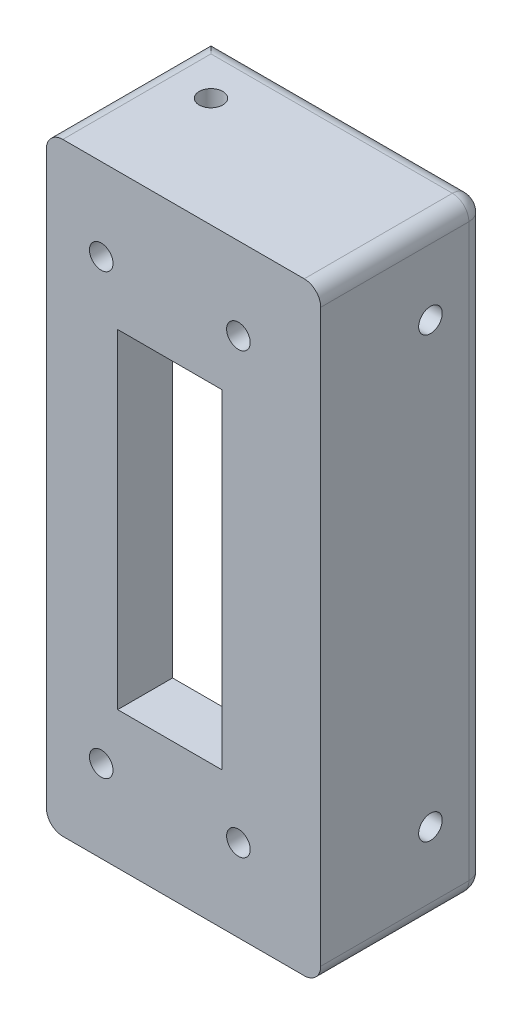
ISO-10303-21;
HEADER;
FILE_DESCRIPTION(('STEP AP214'),'2;1');
FILE_NAME('part.step','',(''),(''),'','','');
FILE_SCHEMA(('AUTOMOTIVE_DESIGN { 1 0 10303 214 1 1 1 1 }'));
ENDSEC;
DATA;
#1=APPLICATION_CONTEXT('core data for automotive mechanical design processes');
#2=APPLICATION_PROTOCOL_DEFINITION('international standard','automotive_design',2000,#1);
#3=PRODUCT_CONTEXT('',#1,'mechanical');
#4=PRODUCT('Part','Part','',(#3));
#5=PRODUCT_RELATED_PRODUCT_CATEGORY('part','',(#4));
#6=PRODUCT_DEFINITION_FORMATION('','',#4);
#7=PRODUCT_DEFINITION_CONTEXT('part definition',#1,'design');
#8=PRODUCT_DEFINITION('design','',#6,#7);
#9=PRODUCT_DEFINITION_SHAPE('','',#8);
#10=(LENGTH_UNIT() NAMED_UNIT(*) SI_UNIT(.MILLI.,.METRE.));
#11=(NAMED_UNIT(*) PLANE_ANGLE_UNIT() SI_UNIT($,.RADIAN.));
#12=(NAMED_UNIT(*) SI_UNIT($,.STERADIAN.) SOLID_ANGLE_UNIT());
#13=UNCERTAINTY_MEASURE_WITH_UNIT(LENGTH_MEASURE(1.E-05),#10,'distance_accuracy_value','');
#14=(GEOMETRIC_REPRESENTATION_CONTEXT(3) GLOBAL_UNCERTAINTY_ASSIGNED_CONTEXT((#13)) GLOBAL_UNIT_ASSIGNED_CONTEXT((#10,
#11,#12)) REPRESENTATION_CONTEXT('',''));
#15=CARTESIAN_POINT('',(0.,0.,0.));
#16=DIRECTION('',(0.,0.,1.));
#17=DIRECTION('',(1.,0.,0.));
#18=AXIS2_PLACEMENT_3D('',#15,#16,#17);
#19=CARTESIAN_POINT('',(0.,0.,0.));
#20=DIRECTION('',(0.,0.,1.));
#21=DIRECTION('',(1.,0.,0.));
#22=AXIS2_PLACEMENT_3D('',#19,#20,#21);
#23=PLANE('',#22);
#24=CARTESIAN_POINT('',(10.,10.,0.));
#25=DIRECTION('',(0.,0.,1.));
#26=DIRECTION('',(1.,0.,0.));
#27=AXIS2_PLACEMENT_3D('',#24,#25,#26);
#28=CIRCLE('',#27,2.15);
#29=CARTESIAN_POINT('',(12.15,10.,0.));
#30=VERTEX_POINT('',#29);
#31=EDGE_CURVE('E509',#30,#30,#28,.T.);
#32=ORIENTED_EDGE('',*,*,#31,.T.);
#33=EDGE_LOOP('',(#32));
#34=FACE_BOUND('',#33,.T.);
#35=CARTESIAN_POINT('',(35.,10.,0.));
#36=DIRECTION('',(0.,0.,1.));
#37=DIRECTION('',(1.,0.,0.));
#38=AXIS2_PLACEMENT_3D('',#35,#36,#37);
#39=CIRCLE('',#38,2.15);
#40=CARTESIAN_POINT('',(37.15,10.,0.));
#41=VERTEX_POINT('',#40);
#42=EDGE_CURVE('E526',#41,#41,#39,.T.);
#43=ORIENTED_EDGE('',*,*,#42,.T.);
#44=EDGE_LOOP('',(#43));
#45=FACE_BOUND('',#44,.T.);
#46=CARTESIAN_POINT('',(10.,90.,0.));
#47=DIRECTION('',(0.,0.,1.));
#48=DIRECTION('',(1.,0.,0.));
#49=AXIS2_PLACEMENT_3D('',#46,#47,#48);
#50=CIRCLE('',#49,2.15);
#51=CARTESIAN_POINT('',(12.15,90.,0.));
#52=VERTEX_POINT('',#51);
#53=EDGE_CURVE('E528',#52,#52,#50,.T.);
#54=ORIENTED_EDGE('',*,*,#53,.T.);
#55=EDGE_LOOP('',(#54));
#56=FACE_BOUND('',#55,.T.);
#57=CARTESIAN_POINT('',(35.,90.,0.));
#58=DIRECTION('',(0.,0.,1.));
#59=DIRECTION('',(1.,0.,0.));
#60=AXIS2_PLACEMENT_3D('',#57,#58,#59);
#61=CIRCLE('',#60,2.15);
#62=CARTESIAN_POINT('',(37.15,90.,0.));
#63=VERTEX_POINT('',#62);
#64=EDGE_CURVE('E441',#63,#63,#61,.T.);
#65=ORIENTED_EDGE('',*,*,#64,.T.);
#66=EDGE_LOOP('',(#65));
#67=FACE_BOUND('',#66,.T.);
#68=DIRECTION('',(1.,0.,0.));
#69=VECTOR('',#68,1.);
#70=CARTESIAN_POINT('',(0.,20.,0.));
#71=LINE('',#70,#69);
#72=CARTESIAN_POINT('',(13.,20.,0.));
#73=VERTEX_POINT('',#72);
#74=CARTESIAN_POINT('',(32.,20.,0.));
#75=VERTEX_POINT('',#74);
#76=EDGE_CURVE('E165',#73,#75,#71,.T.);
#77=ORIENTED_EDGE('',*,*,#76,.T.);
#78=DIRECTION('',(0.,-1.,0.));
#79=VECTOR('',#78,1.);
#80=CARTESIAN_POINT('',(32.,0.,0.));
#81=LINE('',#80,#79);
#82=CARTESIAN_POINT('',(32.,80.,0.));
#83=VERTEX_POINT('',#82);
#84=EDGE_CURVE('E435',#83,#75,#81,.T.);
#85=ORIENTED_EDGE('',*,*,#84,.F.);
#86=DIRECTION('',(1.,0.,0.));
#87=VECTOR('',#86,1.);
#88=CARTESIAN_POINT('',(0.,80.,0.));
#89=LINE('',#88,#87);
#90=CARTESIAN_POINT('',(13.,80.,0.));
#91=VERTEX_POINT('',#90);
#92=EDGE_CURVE('E433',#91,#83,#89,.T.);
#93=ORIENTED_EDGE('',*,*,#92,.F.);
#94=DIRECTION('',(0.,-1.,0.));
#95=VECTOR('',#94,1.);
#96=CARTESIAN_POINT('',(13.,0.,0.));
#97=LINE('',#96,#95);
#98=EDGE_CURVE('E430',#91,#73,#97,.T.);
#99=ORIENTED_EDGE('',*,*,#98,.T.);
#100=EDGE_LOOP('',(#77,#85,#93,#99));
#101=FACE_BOUND('',#100,.T.);
#102=DIRECTION('',(1.,0.,0.));
#103=VECTOR('',#102,1.);
#104=CARTESIAN_POINT('',(0.,0.,0.));
#105=LINE('',#104,#103);
#106=CARTESIAN_POINT('',(0.,0.,0.));
#107=VERTEX_POINT('',#106);
#108=CARTESIAN_POINT('',(45.,0.,0.));
#109=VERTEX_POINT('',#108);
#110=EDGE_CURVE('E176',#107,#109,#105,.T.);
#111=ORIENTED_EDGE('',*,*,#110,.F.);
#112=DIRECTION('',(0.,-1.,0.));
#113=VECTOR('',#112,1.);
#114=CARTESIAN_POINT('',(0.,0.,0.));
#115=LINE('',#114,#113);
#116=CARTESIAN_POINT('',(0.,100.,0.));
#117=VERTEX_POINT('',#116);
#118=EDGE_CURVE('E438',#117,#107,#115,.T.);
#119=ORIENTED_EDGE('',*,*,#118,.F.);
#120=DIRECTION('',(1.,0.,0.));
#121=VECTOR('',#120,1.);
#122=CARTESIAN_POINT('',(0.,100.,0.));
#123=LINE('',#122,#121);
#124=CARTESIAN_POINT('',(45.,100.,0.));
#125=VERTEX_POINT('',#124);
#126=EDGE_CURVE('E190',#117,#125,#123,.T.);
#127=ORIENTED_EDGE('',*,*,#126,.T.);
#128=DIRECTION('',(0.,-1.,0.));
#129=VECTOR('',#128,1.);
#130=CARTESIAN_POINT('',(45.,0.,0.));
#131=LINE('',#130,#129);
#132=EDGE_CURVE('E160',#125,#109,#131,.T.);
#133=ORIENTED_EDGE('',*,*,#132,.T.);
#134=EDGE_LOOP('',(#111,#119,#127,#133));
#135=FACE_BOUND('',#134,.T.);
#136=ADVANCED_FACE('F37',(#34,#45,#56,#67,#101,#135),#23,.F.);
#137=CARTESIAN_POINT('',(0.,105.,10.));
#138=DIRECTION('',(0.,-1.,0.));
#139=DIRECTION('',(0.,0.,-1.));
#140=AXIS2_PLACEMENT_3D('',#137,#138,#139);
#141=PLANE('',#140);
#142=CARTESIAN_POINT('',(10.,105.,-10.));
#143=DIRECTION('',(0.,1.,0.));
#144=DIRECTION('',(0.,0.,1.));
#145=AXIS2_PLACEMENT_3D('',#142,#143,#144);
#146=CIRCLE('',#145,2.15);
#147=CARTESIAN_POINT('',(10.,105.,-7.85));
#148=VERTEX_POINT('',#147);
#149=EDGE_CURVE('E204',#148,#148,#146,.T.);
#150=ORIENTED_EDGE('',*,*,#149,.F.);
#151=EDGE_LOOP('',(#150));
#152=FACE_BOUND('',#151,.T.);
#153=DIRECTION('',(1.,0.,0.));
#154=VECTOR('',#153,1.);
#155=CARTESIAN_POINT('',(0.,105.,-17.));
#156=LINE('',#155,#154);
#157=CARTESIAN_POINT('',(47.,105.,-17.));
#158=VERTEX_POINT('',#157);
#159=CARTESIAN_POINT('',(3.,105.,-17.));
#160=VERTEX_POINT('',#159);
#161=EDGE_CURVE('E46',#158,#160,#156,.F.);
#162=ORIENTED_EDGE('',*,*,#161,.T.);
#163=DIRECTION('',(0.,0.,-1.));
#164=VECTOR('',#163,1.);
#165=CARTESIAN_POINT('',(3.,105.,10.));
#166=LINE('',#165,#164);
#167=CARTESIAN_POINT('',(3.,105.,10.));
#168=VERTEX_POINT('',#167);
#169=EDGE_CURVE('E11',#160,#168,#166,.F.);
#170=ORIENTED_EDGE('',*,*,#169,.T.);
#171=DIRECTION('',(-1.,0.,0.));
#172=VECTOR('',#171,1.);
#173=CARTESIAN_POINT('',(0.,105.,10.));
#174=LINE('',#173,#172);
#175=CARTESIAN_POINT('',(47.,105.,10.));
#176=VERTEX_POINT('',#175);
#177=EDGE_CURVE('E399',#176,#168,#174,.T.);
#178=ORIENTED_EDGE('',*,*,#177,.F.);
#179=DIRECTION('',(0.,0.,-1.));
#180=VECTOR('',#179,1.);
#181=CARTESIAN_POINT('',(47.,105.,10.));
#182=LINE('',#181,#180);
#183=EDGE_CURVE('E57',#176,#158,#182,.T.);
#184=ORIENTED_EDGE('',*,*,#183,.T.);
#185=EDGE_LOOP('',(#162,#170,#178,#184));
#186=FACE_BOUND('',#185,.T.);
#187=ADVANCED_FACE('F302',(#152,#186),#141,.F.);
#188=CARTESIAN_POINT('',(0.,0.,10.));
#189=DIRECTION('',(1.,0.,0.));
#190=DIRECTION('',(0.,0.,-1.));
#191=AXIS2_PLACEMENT_3D('',#188,#189,#190);
#192=PLANE('',#191);
#193=DIRECTION('',(0.,1.,0.));
#194=VECTOR('',#193,1.);
#195=CARTESIAN_POINT('',(0.,0.,-20.));
#196=LINE('',#195,#194);
#197=CARTESIAN_POINT('',(0.,-2.00000000000001,-20.));
#198=VERTEX_POINT('',#197);
#199=CARTESIAN_POINT('',(0.,0.,-20.));
#200=VERTEX_POINT('',#199);
#201=EDGE_CURVE('E182',#198,#200,#196,.T.);
#202=ORIENTED_EDGE('',*,*,#201,.F.);
#203=DIRECTION('',(0.,0.,-1.));
#204=VECTOR('',#203,1.);
#205=CARTESIAN_POINT('',(0.,-2.00000000000001,10.));
#206=LINE('',#205,#204);
#207=CARTESIAN_POINT('',(0.,-2.00000000000001,10.));
#208=VERTEX_POINT('',#207);
#209=EDGE_CURVE('E215',#198,#208,#206,.F.);
#210=ORIENTED_EDGE('',*,*,#209,.T.);
#211=DIRECTION('',(0.,-1.,0.));
#212=VECTOR('',#211,1.);
#213=CARTESIAN_POINT('',(0.,0.,10.));
#214=LINE('',#213,#212);
#215=CARTESIAN_POINT('',(0.,102.,10.));
#216=VERTEX_POINT('',#215);
#217=EDGE_CURVE('E403',#216,#208,#214,.T.);
#218=ORIENTED_EDGE('',*,*,#217,.F.);
#219=DIRECTION('',(0.,0.,-1.));
#220=VECTOR('',#219,1.);
#221=CARTESIAN_POINT('',(0.,102.,10.));
#222=LINE('',#221,#220);
#223=CARTESIAN_POINT('',(0.,102.,-20.));
#224=VERTEX_POINT('',#223);
#225=EDGE_CURVE('E213',#216,#224,#222,.T.);
#226=ORIENTED_EDGE('',*,*,#225,.T.);
#227=DIRECTION('',(0.,1.,0.));
#228=VECTOR('',#227,1.);
#229=CARTESIAN_POINT('',(0.,0.,-20.));
#230=LINE('',#229,#228);
#231=CARTESIAN_POINT('',(0.,100.,-20.));
#232=VERTEX_POINT('',#231);
#233=EDGE_CURVE('E180',#232,#224,#230,.T.);
#234=ORIENTED_EDGE('',*,*,#233,.F.);
#235=DIRECTION('',(0.,0.,1.));
#236=VECTOR('',#235,1.);
#237=CARTESIAN_POINT('',(0.,100.,-20.));
#238=LINE('',#237,#236);
#239=EDGE_CURVE('E166',#232,#117,#238,.T.);
#240=ORIENTED_EDGE('',*,*,#239,.T.);
#241=ORIENTED_EDGE('',*,*,#118,.T.);
#242=DIRECTION('',(0.,0.,1.));
#243=VECTOR('',#242,1.);
#244=CARTESIAN_POINT('',(0.,0.,-20.));
#245=LINE('',#244,#243);
#246=EDGE_CURVE('E449',#200,#107,#245,.T.);
#247=ORIENTED_EDGE('',*,*,#246,.F.);
#248=EDGE_LOOP('',(#202,#210,#218,#226,#234,#240,#241,#247));
#249=FACE_BOUND('',#248,.T.);
#250=ADVANCED_FACE('F308',(#249),#192,.F.);
#251=CARTESIAN_POINT('',(0.,-5.00000000000001,10.));
#252=DIRECTION('',(0.,-1.,0.));
#253=DIRECTION('',(1.,0.,0.));
#254=AXIS2_PLACEMENT_3D('',#251,#252,#253);
#255=PLANE('',#254);
#256=CARTESIAN_POINT('',(10.,-5.,-10.));
#257=DIRECTION('',(0.,-1.,0.));
#258=DIRECTION('',(1.,0.,0.));
#259=AXIS2_PLACEMENT_3D('',#256,#257,#258);
#260=CIRCLE('',#259,2.15);
#261=CARTESIAN_POINT('',(12.15,-5.,-10.));
#262=VERTEX_POINT('',#261);
#263=EDGE_CURVE('E271',#262,#262,#260,.T.);
#264=ORIENTED_EDGE('',*,*,#263,.F.);
#265=EDGE_LOOP('',(#264));
#266=FACE_BOUND('',#265,.T.);
#267=DIRECTION('',(-1.,0.,0.));
#268=VECTOR('',#267,1.);
#269=CARTESIAN_POINT('',(0.,-5.00000000000001,10.));
#270=LINE('',#269,#268);
#271=CARTESIAN_POINT('',(47.0000000000001,-5.,10.));
#272=VERTEX_POINT('',#271);
#273=CARTESIAN_POINT('',(3.,-5.00000000000001,10.));
#274=VERTEX_POINT('',#273);
#275=EDGE_CURVE('E406',#272,#274,#270,.T.);
#276=ORIENTED_EDGE('',*,*,#275,.T.);
#277=DIRECTION('',(0.,0.,-1.));
#278=VECTOR('',#277,1.);
#279=CARTESIAN_POINT('',(3.,-5.00000000000001,-20.));
#280=LINE('',#279,#278);
#281=CARTESIAN_POINT('',(3.,-5.00000000000001,-17.));
#282=VERTEX_POINT('',#281);
#283=EDGE_CURVE('E210',#274,#282,#280,.T.);
#284=ORIENTED_EDGE('',*,*,#283,.T.);
#285=DIRECTION('',(-1.,0.,0.));
#286=VECTOR('',#285,1.);
#287=CARTESIAN_POINT('',(0.,-5.00000000000001,-17.));
#288=LINE('',#287,#286);
#289=CARTESIAN_POINT('',(47.0000000000001,-5.,-17.));
#290=VERTEX_POINT('',#289);
#291=EDGE_CURVE('E207',#282,#290,#288,.F.);
#292=ORIENTED_EDGE('',*,*,#291,.T.);
#293=DIRECTION('',(0.,0.,-1.));
#294=VECTOR('',#293,1.);
#295=CARTESIAN_POINT('',(47.0000000000001,-5.,10.));
#296=LINE('',#295,#294);
#297=EDGE_CURVE('E205',#290,#272,#296,.F.);
#298=ORIENTED_EDGE('',*,*,#297,.T.);
#299=EDGE_LOOP('',(#276,#284,#292,#298));
#300=FACE_BOUND('',#299,.T.);
#301=ADVANCED_FACE('F338',(#266,#300),#255,.T.);
#302=CARTESIAN_POINT('',(0.,20.,10.));
#303=DIRECTION('',(0.,1.,0.));
#304=DIRECTION('',(0.,0.,1.));
#305=AXIS2_PLACEMENT_3D('',#302,#303,#304);
#306=PLANE('',#305);
#307=ORIENTED_EDGE('',*,*,#76,.F.);
#308=DIRECTION('',(0.,0.,-1.));
#309=VECTOR('',#308,1.);
#310=CARTESIAN_POINT('',(13.,20.,10.));
#311=LINE('',#310,#309);
#312=CARTESIAN_POINT('',(13.,20.,10.));
#313=VERTEX_POINT('',#312);
#314=EDGE_CURVE('E208',#313,#73,#311,.T.);
#315=ORIENTED_EDGE('',*,*,#314,.F.);
#316=DIRECTION('',(1.,0.,0.));
#317=VECTOR('',#316,1.);
#318=CARTESIAN_POINT('',(0.,20.,10.));
#319=LINE('',#318,#317);
#320=CARTESIAN_POINT('',(32.,20.,10.));
#321=VERTEX_POINT('',#320);
#322=EDGE_CURVE('E504',#313,#321,#319,.T.);
#323=ORIENTED_EDGE('',*,*,#322,.T.);
#324=DIRECTION('',(0.,0.,-1.));
#325=VECTOR('',#324,1.);
#326=CARTESIAN_POINT('',(32.,20.,10.));
#327=LINE('',#326,#325);
#328=EDGE_CURVE('E427',#321,#75,#327,.T.);
#329=ORIENTED_EDGE('',*,*,#328,.T.);
#330=EDGE_LOOP('',(#307,#315,#323,#329));
#331=FACE_BOUND('',#330,.T.);
#332=ADVANCED_FACE('F341',(#331),#306,.T.);
#333=CARTESIAN_POINT('',(13.,0.,10.));
#334=DIRECTION('',(1.,0.,0.));
#335=DIRECTION('',(0.,1.,0.));
#336=AXIS2_PLACEMENT_3D('',#333,#334,#335);
#337=PLANE('',#336);
#338=ORIENTED_EDGE('',*,*,#98,.F.);
#339=DIRECTION('',(0.,0.,-1.));
#340=VECTOR('',#339,1.);
#341=CARTESIAN_POINT('',(13.,80.,10.));
#342=LINE('',#341,#340);
#343=CARTESIAN_POINT('',(13.,80.,10.));
#344=VERTEX_POINT('',#343);
#345=EDGE_CURVE('E513',#344,#91,#342,.T.);
#346=ORIENTED_EDGE('',*,*,#345,.F.);
#347=DIRECTION('',(0.,-1.,0.));
#348=VECTOR('',#347,1.);
#349=CARTESIAN_POINT('',(13.,0.,10.));
#350=LINE('',#349,#348);
#351=EDGE_CURVE('E506',#344,#313,#350,.T.);
#352=ORIENTED_EDGE('',*,*,#351,.T.);
#353=ORIENTED_EDGE('',*,*,#314,.T.);
#354=EDGE_LOOP('',(#338,#346,#352,#353));
#355=FACE_BOUND('',#354,.T.);
#356=ADVANCED_FACE('F351',(#355),#337,.T.);
#357=CARTESIAN_POINT('',(0.,80.,10.));
#358=DIRECTION('',(0.,1.,0.));
#359=DIRECTION('',(0.,0.,1.));
#360=AXIS2_PLACEMENT_3D('',#357,#358,#359);
#361=PLANE('',#360);
#362=ORIENTED_EDGE('',*,*,#92,.T.);
#363=DIRECTION('',(0.,0.,-1.));
#364=VECTOR('',#363,1.);
#365=CARTESIAN_POINT('',(32.,80.,10.));
#366=LINE('',#365,#364);
#367=CARTESIAN_POINT('',(32.,80.,10.));
#368=VERTEX_POINT('',#367);
#369=EDGE_CURVE('E518',#368,#83,#366,.T.);
#370=ORIENTED_EDGE('',*,*,#369,.F.);
#371=DIRECTION('',(1.,0.,0.));
#372=VECTOR('',#371,1.);
#373=CARTESIAN_POINT('',(0.,80.,10.));
#374=LINE('',#373,#372);
#375=EDGE_CURVE('E408',#344,#368,#374,.T.);
#376=ORIENTED_EDGE('',*,*,#375,.F.);
#377=ORIENTED_EDGE('',*,*,#345,.T.);
#378=EDGE_LOOP('',(#362,#370,#376,#377));
#379=FACE_BOUND('',#378,.T.);
#380=ADVANCED_FACE('F326',(#379),#361,.F.);
#381=CARTESIAN_POINT('',(35.,10.,10.));
#382=DIRECTION('',(0.,0.,-1.));
#383=DIRECTION('',(-1.,0.,0.));
#384=AXIS2_PLACEMENT_3D('',#381,#382,#383);
#385=CYLINDRICAL_SURFACE('',#384,2.15);
#386=CARTESIAN_POINT('',(35.,10.,10.));
#387=DIRECTION('',(0.,0.,1.));
#388=DIRECTION('',(1.,0.,0.));
#389=AXIS2_PLACEMENT_3D('',#386,#387,#388);
#390=CIRCLE('',#389,2.15);
#391=CARTESIAN_POINT('',(37.15,10.,10.));
#392=VERTEX_POINT('',#391);
#393=EDGE_CURVE('E421',#392,#392,#390,.T.);
#394=ORIENTED_EDGE('',*,*,#393,.T.);
#395=EDGE_LOOP('',(#394));
#396=FACE_BOUND('',#395,.T.);
#397=ORIENTED_EDGE('',*,*,#42,.F.);
#398=EDGE_LOOP('',(#397));
#399=FACE_BOUND('',#398,.T.);
#400=ADVANCED_FACE('F322',(#396,#399),#385,.F.);
#401=CARTESIAN_POINT('',(10.,90.,10.));
#402=DIRECTION('',(0.,0.,-1.));
#403=DIRECTION('',(-1.,0.,0.));
#404=AXIS2_PLACEMENT_3D('',#401,#402,#403);
#405=CYLINDRICAL_SURFACE('',#404,2.15);
#406=CARTESIAN_POINT('',(10.,90.,10.));
#407=DIRECTION('',(0.,0.,1.));
#408=DIRECTION('',(1.,0.,0.));
#409=AXIS2_PLACEMENT_3D('',#406,#407,#408);
#410=CIRCLE('',#409,2.15);
#411=CARTESIAN_POINT('',(12.15,90.,10.));
#412=VERTEX_POINT('',#411);
#413=EDGE_CURVE('E418',#412,#412,#410,.T.);
#414=ORIENTED_EDGE('',*,*,#413,.T.);
#415=EDGE_LOOP('',(#414));
#416=FACE_BOUND('',#415,.T.);
#417=ORIENTED_EDGE('',*,*,#53,.F.);
#418=EDGE_LOOP('',(#417));
#419=FACE_BOUND('',#418,.T.);
#420=ADVANCED_FACE('F325',(#416,#419),#405,.F.);
#421=CARTESIAN_POINT('',(35.,90.,10.));
#422=DIRECTION('',(0.,0.,-1.));
#423=DIRECTION('',(-1.,0.,0.));
#424=AXIS2_PLACEMENT_3D('',#421,#422,#423);
#425=CYLINDRICAL_SURFACE('',#424,2.15);
#426=CARTESIAN_POINT('',(35.,90.,10.));
#427=DIRECTION('',(0.,0.,1.));
#428=DIRECTION('',(1.,0.,0.));
#429=AXIS2_PLACEMENT_3D('',#426,#427,#428);
#430=CIRCLE('',#429,2.15);
#431=CARTESIAN_POINT('',(37.15,90.,10.));
#432=VERTEX_POINT('',#431);
#433=EDGE_CURVE('E415',#432,#432,#430,.T.);
#434=ORIENTED_EDGE('',*,*,#433,.T.);
#435=EDGE_LOOP('',(#434));
#436=FACE_BOUND('',#435,.T.);
#437=ORIENTED_EDGE('',*,*,#64,.F.);
#438=EDGE_LOOP('',(#437));
#439=FACE_BOUND('',#438,.T.);
#440=ADVANCED_FACE('F330',(#436,#439),#425,.F.);
#441=CARTESIAN_POINT('',(50.0000000000001,0.,10.));
#442=DIRECTION('',(-1.,0.,0.));
#443=DIRECTION('',(0.,-1.,0.));
#444=AXIS2_PLACEMENT_3D('',#441,#442,#443);
#445=PLANE('',#444);
#446=DIRECTION('',(0.,1.,0.));
#447=VECTOR('',#446,1.);
#448=CARTESIAN_POINT('',(50.0000000000001,0.,10.));
#449=LINE('',#448,#447);
#450=CARTESIAN_POINT('',(50.0000000000001,-2.,10.));
#451=VERTEX_POINT('',#450);
#452=CARTESIAN_POINT('',(50.,102.,10.));
#453=VERTEX_POINT('',#452);
#454=EDGE_CURVE('E402',#451,#453,#449,.T.);
#455=ORIENTED_EDGE('',*,*,#454,.F.);
#456=DIRECTION('',(0.,0.,-1.));
#457=VECTOR('',#456,1.);
#458=CARTESIAN_POINT('',(50.0000000000001,-2.,-20.));
#459=LINE('',#458,#457);
#460=CARTESIAN_POINT('',(50.0000000000001,-2.,-17.));
#461=VERTEX_POINT('',#460);
#462=EDGE_CURVE('E235',#451,#461,#459,.T.);
#463=ORIENTED_EDGE('',*,*,#462,.T.);
#464=DIRECTION('',(0.,-1.,0.));
#465=VECTOR('',#464,1.);
#466=CARTESIAN_POINT('',(50.,105.,-17.));
#467=LINE('',#466,#465);
#468=CARTESIAN_POINT('',(50.,102.,-17.));
#469=VERTEX_POINT('',#468);
#470=EDGE_CURVE('E231',#461,#469,#467,.F.);
#471=ORIENTED_EDGE('',*,*,#470,.T.);
#472=DIRECTION('',(0.,0.,-1.));
#473=VECTOR('',#472,1.);
#474=CARTESIAN_POINT('',(50.,102.,10.));
#475=LINE('',#474,#473);
#476=EDGE_CURVE('E233',#469,#453,#475,.F.);
#477=ORIENTED_EDGE('',*,*,#476,.T.);
#478=EDGE_LOOP('',(#455,#463,#471,#477));
#479=FACE_BOUND('',#478,.T.);
#480=CARTESIAN_POINT('',(50.0000000000001,9.99999999999999,-10.));
#481=DIRECTION('',(-1.,0.,0.));
#482=DIRECTION('',(0.,-1.,0.));
#483=AXIS2_PLACEMENT_3D('',#480,#481,#482);
#484=CIRCLE('',#483,2.15);
#485=CARTESIAN_POINT('',(50.0000000000001,7.84999999999999,-10.));
#486=VERTEX_POINT('',#485);
#487=EDGE_CURVE('E277',#486,#486,#484,.T.);
#488=ORIENTED_EDGE('',*,*,#487,.T.);
#489=EDGE_LOOP('',(#488));
#490=FACE_BOUND('',#489,.T.);
#491=CARTESIAN_POINT('',(50.,90.,-10.));
#492=DIRECTION('',(-1.,0.,0.));
#493=DIRECTION('',(0.,-1.,0.));
#494=AXIS2_PLACEMENT_3D('',#491,#492,#493);
#495=CIRCLE('',#494,2.15);
#496=CARTESIAN_POINT('',(50.,87.85,-10.));
#497=VERTEX_POINT('',#496);
#498=EDGE_CURVE('E191',#497,#497,#495,.T.);
#499=ORIENTED_EDGE('',*,*,#498,.T.);
#500=EDGE_LOOP('',(#499));
#501=FACE_BOUND('',#500,.T.);
#502=ADVANCED_FACE('F285',(#479,#490,#501),#445,.F.);
#503=CARTESIAN_POINT('',(32.,0.,10.));
#504=DIRECTION('',(1.,0.,0.));
#505=DIRECTION('',(0.,1.,0.));
#506=AXIS2_PLACEMENT_3D('',#503,#504,#505);
#507=PLANE('',#506);
#508=ORIENTED_EDGE('',*,*,#84,.T.);
#509=ORIENTED_EDGE('',*,*,#328,.F.);
#510=DIRECTION('',(0.,-1.,0.));
#511=VECTOR('',#510,1.);
#512=CARTESIAN_POINT('',(32.,0.,10.));
#513=LINE('',#512,#511);
#514=EDGE_CURVE('E404',#368,#321,#513,.T.);
#515=ORIENTED_EDGE('',*,*,#514,.F.);
#516=ORIENTED_EDGE('',*,*,#369,.T.);
#517=EDGE_LOOP('',(#508,#509,#515,#516));
#518=FACE_BOUND('',#517,.T.);
#519=ADVANCED_FACE('F320',(#518),#507,.F.);
#520=CARTESIAN_POINT('',(10.,10.,10.));
#521=DIRECTION('',(0.,0.,-1.));
#522=DIRECTION('',(-1.,0.,0.));
#523=AXIS2_PLACEMENT_3D('',#520,#521,#522);
#524=CYLINDRICAL_SURFACE('',#523,2.15);
#525=CARTESIAN_POINT('',(10.,10.,10.));
#526=DIRECTION('',(0.,0.,1.));
#527=DIRECTION('',(1.,0.,0.));
#528=AXIS2_PLACEMENT_3D('',#525,#526,#527);
#529=CIRCLE('',#528,2.15);
#530=CARTESIAN_POINT('',(12.15,10.,10.));
#531=VERTEX_POINT('',#530);
#532=EDGE_CURVE('E424',#531,#531,#529,.T.);
#533=ORIENTED_EDGE('',*,*,#532,.T.);
#534=EDGE_LOOP('',(#533));
#535=FACE_BOUND('',#534,.T.);
#536=ORIENTED_EDGE('',*,*,#31,.F.);
#537=EDGE_LOOP('',(#536));
#538=FACE_BOUND('',#537,.T.);
#539=ADVANCED_FACE('F317',(#535,#538),#524,.F.);
#540=CARTESIAN_POINT('',(0.,0.,10.));
#541=DIRECTION('',(0.,0.,1.));
#542=DIRECTION('',(1.,0.,0.));
#543=AXIS2_PLACEMENT_3D('',#540,#541,#542);
#544=PLANE('',#543);
#545=ORIENTED_EDGE('',*,*,#322,.F.);
#546=ORIENTED_EDGE('',*,*,#351,.F.);
#547=ORIENTED_EDGE('',*,*,#375,.T.);
#548=ORIENTED_EDGE('',*,*,#514,.T.);
#549=EDGE_LOOP('',(#545,#546,#547,#548));
#550=FACE_BOUND('',#549,.T.);
#551=ORIENTED_EDGE('',*,*,#217,.T.);
#552=CARTESIAN_POINT('',(3.,-2.00000000000001,10.));
#553=DIRECTION('',(0.,0.,1.));
#554=DIRECTION('',(1.,0.,0.));
#555=AXIS2_PLACEMENT_3D('',#552,#553,#554);
#556=CIRCLE('',#555,3.);
#557=EDGE_CURVE('E223',#208,#274,#556,.T.);
#558=ORIENTED_EDGE('',*,*,#557,.T.);
#559=ORIENTED_EDGE('',*,*,#275,.F.);
#560=CARTESIAN_POINT('',(47.0000000000001,-2.,10.));
#561=DIRECTION('',(0.,0.,1.));
#562=DIRECTION('',(1.,0.,0.));
#563=AXIS2_PLACEMENT_3D('',#560,#561,#562);
#564=CIRCLE('',#563,3.);
#565=EDGE_CURVE('E221',#272,#451,#564,.T.);
#566=ORIENTED_EDGE('',*,*,#565,.T.);
#567=ORIENTED_EDGE('',*,*,#454,.T.);
#568=CARTESIAN_POINT('',(47.,102.,10.));
#569=DIRECTION('',(0.,0.,1.));
#570=DIRECTION('',(1.,0.,0.));
#571=AXIS2_PLACEMENT_3D('',#568,#569,#570);
#572=CIRCLE('',#571,3.);
#573=EDGE_CURVE('E217',#453,#176,#572,.T.);
#574=ORIENTED_EDGE('',*,*,#573,.T.);
#575=ORIENTED_EDGE('',*,*,#177,.T.);
#576=CARTESIAN_POINT('',(3.,102.,10.));
#577=DIRECTION('',(0.,0.,1.));
#578=DIRECTION('',(1.,0.,0.));
#579=AXIS2_PLACEMENT_3D('',#576,#577,#578);
#580=CIRCLE('',#579,3.);
#581=EDGE_CURVE('E219',#168,#216,#580,.T.);
#582=ORIENTED_EDGE('',*,*,#581,.T.);
#583=EDGE_LOOP('',(#551,#558,#559,#566,#567,#574,#575,#582));
#584=FACE_BOUND('',#583,.T.);
#585=ORIENTED_EDGE('',*,*,#433,.F.);
#586=EDGE_LOOP('',(#585));
#587=FACE_BOUND('',#586,.T.);
#588=ORIENTED_EDGE('',*,*,#413,.F.);
#589=EDGE_LOOP('',(#588));
#590=FACE_BOUND('',#589,.T.);
#591=ORIENTED_EDGE('',*,*,#393,.F.);
#592=EDGE_LOOP('',(#591));
#593=FACE_BOUND('',#592,.T.);
#594=ORIENTED_EDGE('',*,*,#532,.F.);
#595=EDGE_LOOP('',(#594));
#596=FACE_BOUND('',#595,.T.);
#597=ADVANCED_FACE('F315',(#550,#584,#587,#590,#593,#596),#544,.T.);
#598=CARTESIAN_POINT('',(45.,0.,-20.));
#599=DIRECTION('',(-1.,0.,0.));
#600=DIRECTION('',(0.,-1.,0.));
#601=AXIS2_PLACEMENT_3D('',#598,#599,#600);
#602=PLANE('',#601);
#603=CARTESIAN_POINT('',(45.,9.99999999999999,-10.));
#604=DIRECTION('',(-1.,0.,0.));
#605=DIRECTION('',(0.,0.,1.));
#606=AXIS2_PLACEMENT_3D('',#603,#604,#605);
#607=CIRCLE('',#606,2.15);
#608=CARTESIAN_POINT('',(45.,9.99999999999999,-7.85));
#609=VERTEX_POINT('',#608);
#610=EDGE_CURVE('E274',#609,#609,#607,.T.);
#611=ORIENTED_EDGE('',*,*,#610,.F.);
#612=EDGE_LOOP('',(#611));
#613=FACE_BOUND('',#612,.T.);
#614=CARTESIAN_POINT('',(45.,90.,-10.));
#615=DIRECTION('',(-1.,0.,0.));
#616=DIRECTION('',(0.,0.,1.));
#617=AXIS2_PLACEMENT_3D('',#614,#615,#616);
#618=CIRCLE('',#617,2.15);
#619=CARTESIAN_POINT('',(45.,90.,-7.85));
#620=VERTEX_POINT('',#619);
#621=EDGE_CURVE('E280',#620,#620,#618,.T.);
#622=ORIENTED_EDGE('',*,*,#621,.F.);
#623=EDGE_LOOP('',(#622));
#624=FACE_BOUND('',#623,.T.);
#625=ORIENTED_EDGE('',*,*,#132,.F.);
#626=DIRECTION('',(0.,0.,1.));
#627=VECTOR('',#626,1.);
#628=CARTESIAN_POINT('',(45.,100.,-20.));
#629=LINE('',#628,#627);
#630=CARTESIAN_POINT('',(45.,100.,-20.));
#631=VERTEX_POINT('',#630);
#632=EDGE_CURVE('E155',#631,#125,#629,.T.);
#633=ORIENTED_EDGE('',*,*,#632,.F.);
#634=DIRECTION('',(0.,-1.,0.));
#635=VECTOR('',#634,1.);
#636=CARTESIAN_POINT('',(45.,0.,-20.));
#637=LINE('',#636,#635);
#638=CARTESIAN_POINT('',(45.,0.,-20.));
#639=VERTEX_POINT('',#638);
#640=EDGE_CURVE('E158',#631,#639,#637,.T.);
#641=ORIENTED_EDGE('',*,*,#640,.T.);
#642=DIRECTION('',(0.,0.,1.));
#643=VECTOR('',#642,1.);
#644=CARTESIAN_POINT('',(45.,0.,-20.));
#645=LINE('',#644,#643);
#646=EDGE_CURVE('E188',#639,#109,#645,.T.);
#647=ORIENTED_EDGE('',*,*,#646,.T.);
#648=EDGE_LOOP('',(#625,#633,#641,#647));
#649=FACE_BOUND('',#648,.T.);
#650=ADVANCED_FACE('F157',(#613,#624,#649),#602,.T.);
#651=CARTESIAN_POINT('',(0.,100.,-20.));
#652=DIRECTION('',(0.,-1.,0.));
#653=DIRECTION('',(0.,0.,-1.));
#654=AXIS2_PLACEMENT_3D('',#651,#652,#653);
#655=PLANE('',#654);
#656=CARTESIAN_POINT('',(10.,100.,-10.));
#657=DIRECTION('',(0.,-1.,0.));
#658=DIRECTION('',(0.,0.,-1.));
#659=AXIS2_PLACEMENT_3D('',#656,#657,#658);
#660=CIRCLE('',#659,2.15);
#661=CARTESIAN_POINT('',(10.,100.,-12.15));
#662=VERTEX_POINT('',#661);
#663=EDGE_CURVE('E203',#662,#662,#660,.T.);
#664=ORIENTED_EDGE('',*,*,#663,.F.);
#665=EDGE_LOOP('',(#664));
#666=FACE_BOUND('',#665,.T.);
#667=ORIENTED_EDGE('',*,*,#126,.F.);
#668=ORIENTED_EDGE('',*,*,#239,.F.);
#669=DIRECTION('',(1.,0.,0.));
#670=VECTOR('',#669,1.);
#671=CARTESIAN_POINT('',(0.,100.,-20.));
#672=LINE('',#671,#670);
#673=EDGE_CURVE('E172',#232,#631,#672,.T.);
#674=ORIENTED_EDGE('',*,*,#673,.T.);
#675=ORIENTED_EDGE('',*,*,#632,.T.);
#676=EDGE_LOOP('',(#667,#668,#674,#675));
#677=FACE_BOUND('',#676,.T.);
#678=ADVANCED_FACE('F178',(#666,#677),#655,.T.);
#679=CARTESIAN_POINT('',(0.,0.,-20.));
#680=DIRECTION('',(0.,-1.,0.));
#681=DIRECTION('',(0.,0.,-1.));
#682=AXIS2_PLACEMENT_3D('',#679,#680,#681);
#683=PLANE('',#682);
#684=CARTESIAN_POINT('',(10.,0.,-10.));
#685=DIRECTION('',(0.,-1.,0.));
#686=DIRECTION('',(0.,0.,-1.));
#687=AXIS2_PLACEMENT_3D('',#684,#685,#686);
#688=CIRCLE('',#687,2.15);
#689=CARTESIAN_POINT('',(10.,0.,-12.15));
#690=VERTEX_POINT('',#689);
#691=EDGE_CURVE('E200',#690,#690,#688,.T.);
#692=ORIENTED_EDGE('',*,*,#691,.T.);
#693=EDGE_LOOP('',(#692));
#694=FACE_BOUND('',#693,.T.);
#695=ORIENTED_EDGE('',*,*,#110,.T.);
#696=ORIENTED_EDGE('',*,*,#646,.F.);
#697=DIRECTION('',(1.,0.,0.));
#698=VECTOR('',#697,1.);
#699=CARTESIAN_POINT('',(0.,0.,-20.));
#700=LINE('',#699,#698);
#701=EDGE_CURVE('E174',#200,#639,#700,.T.);
#702=ORIENTED_EDGE('',*,*,#701,.F.);
#703=ORIENTED_EDGE('',*,*,#246,.T.);
#704=EDGE_LOOP('',(#695,#696,#702,#703));
#705=FACE_BOUND('',#704,.T.);
#706=ADVANCED_FACE('F299',(#694,#705),#683,.F.);
#707=CARTESIAN_POINT('',(0.,0.,-20.));
#708=DIRECTION('',(0.,0.,-1.));
#709=DIRECTION('',(-1.,0.,0.));
#710=AXIS2_PLACEMENT_3D('',#707,#708,#709);
#711=PLANE('',#710);
#712=DIRECTION('',(0.,-1.,0.));
#713=VECTOR('',#712,1.);
#714=CARTESIAN_POINT('',(47.0000000000001,-5.,-20.));
#715=LINE('',#714,#713);
#716=CARTESIAN_POINT('',(47.,102.,-20.));
#717=VERTEX_POINT('',#716);
#718=CARTESIAN_POINT('',(47.0000000000001,-2.,-20.));
#719=VERTEX_POINT('',#718);
#720=EDGE_CURVE('E225',#717,#719,#715,.T.);
#721=ORIENTED_EDGE('',*,*,#720,.T.);
#722=DIRECTION('',(-1.,0.,0.));
#723=VECTOR('',#722,1.);
#724=CARTESIAN_POINT('',(0.,-2.00000000000001,-20.));
#725=LINE('',#724,#723);
#726=EDGE_CURVE('E229',#719,#198,#725,.T.);
#727=ORIENTED_EDGE('',*,*,#726,.T.);
#728=ORIENTED_EDGE('',*,*,#201,.T.);
#729=ORIENTED_EDGE('',*,*,#701,.T.);
#730=ORIENTED_EDGE('',*,*,#640,.F.);
#731=ORIENTED_EDGE('',*,*,#673,.F.);
#732=ORIENTED_EDGE('',*,*,#233,.T.);
#733=DIRECTION('',(1.,0.,0.));
#734=VECTOR('',#733,1.);
#735=CARTESIAN_POINT('',(50.,102.,-20.));
#736=LINE('',#735,#734);
#737=EDGE_CURVE('E227',#224,#717,#736,.T.);
#738=ORIENTED_EDGE('',*,*,#737,.T.);
#739=EDGE_LOOP('',(#721,#727,#728,#729,#730,#731,#732,#738));
#740=FACE_BOUND('',#739,.T.);
#741=ADVANCED_FACE('F170',(#740),#711,.T.);
#742=CARTESIAN_POINT('',(65.,90.,-10.));
#743=DIRECTION('',(-1.,0.,0.));
#744=DIRECTION('',(0.,0.,1.));
#745=AXIS2_PLACEMENT_3D('',#742,#743,#744);
#746=CYLINDRICAL_SURFACE('',#745,2.15);
#747=ORIENTED_EDGE('',*,*,#621,.T.);
#748=EDGE_LOOP('',(#747));
#749=FACE_BOUND('',#748,.T.);
#750=ORIENTED_EDGE('',*,*,#498,.F.);
#751=EDGE_LOOP('',(#750));
#752=FACE_BOUND('',#751,.T.);
#753=ADVANCED_FACE('F287',(#749,#752),#746,.F.);
#754=CARTESIAN_POINT('',(65.,9.99999999999999,-10.));
#755=DIRECTION('',(-1.,0.,0.));
#756=DIRECTION('',(0.,0.,1.));
#757=AXIS2_PLACEMENT_3D('',#754,#755,#756);
#758=CYLINDRICAL_SURFACE('',#757,2.15);
#759=ORIENTED_EDGE('',*,*,#610,.T.);
#760=EDGE_LOOP('',(#759));
#761=FACE_BOUND('',#760,.T.);
#762=ORIENTED_EDGE('',*,*,#487,.F.);
#763=EDGE_LOOP('',(#762));
#764=FACE_BOUND('',#763,.T.);
#765=ADVANCED_FACE('F289',(#761,#764),#758,.F.);
#766=CARTESIAN_POINT('',(10.,-15.,-10.));
#767=DIRECTION('',(0.,1.,0.));
#768=DIRECTION('',(0.,0.,1.));
#769=AXIS2_PLACEMENT_3D('',#766,#767,#768);
#770=CYLINDRICAL_SURFACE('',#769,2.15);
#771=ORIENTED_EDGE('',*,*,#263,.T.);
#772=EDGE_LOOP('',(#771));
#773=FACE_BOUND('',#772,.T.);
#774=ORIENTED_EDGE('',*,*,#691,.F.);
#775=EDGE_LOOP('',(#774));
#776=FACE_BOUND('',#775,.T.);
#777=ADVANCED_FACE('F296',(#773,#776),#770,.F.);
#778=ORIENTED_EDGE('',*,*,#663,.T.);
#779=EDGE_LOOP('',(#778));
#780=FACE_BOUND('',#779,.T.);
#781=ORIENTED_EDGE('',*,*,#149,.T.);
#782=EDGE_LOOP('',(#781));
#783=FACE_BOUND('',#782,.T.);
#784=ADVANCED_FACE('F390',(#780,#783),#770,.F.);
#785=CARTESIAN_POINT('',(3.,102.,10.));
#786=DIRECTION('',(0.,0.,-1.));
#787=DIRECTION('',(-1.,0.,0.));
#788=AXIS2_PLACEMENT_3D('',#785,#786,#787);
#789=CYLINDRICAL_SURFACE('',#788,3.);
#790=ORIENTED_EDGE('',*,*,#581,.F.);
#791=ORIENTED_EDGE('',*,*,#169,.F.);
#792=CARTESIAN_POINT('',(3.,102.,-17.));
#793=DIRECTION('',(0.707106781186547,0.,-0.707106781186547));
#794=DIRECTION('',(-0.707106781186547,0.,-0.707106781186547));
#795=AXIS2_PLACEMENT_3D('',#792,#793,#794);
#796=ELLIPSE('',#795,4.24264068711928,3.);
#797=EDGE_CURVE('E41',#224,#160,#796,.T.);
#798=ORIENTED_EDGE('',*,*,#797,.F.);
#799=ORIENTED_EDGE('',*,*,#225,.F.);
#800=EDGE_LOOP('',(#790,#791,#798,#799));
#801=FACE_BOUND('',#800,.T.);
#802=ADVANCED_FACE('F39',(#801),#789,.T.);
#803=CARTESIAN_POINT('',(47.,102.,10.));
#804=DIRECTION('',(0.,0.,-1.));
#805=DIRECTION('',(-1.,0.,0.));
#806=AXIS2_PLACEMENT_3D('',#803,#804,#805);
#807=CYLINDRICAL_SURFACE('',#806,3.);
#808=ORIENTED_EDGE('',*,*,#573,.F.);
#809=ORIENTED_EDGE('',*,*,#476,.F.);
#810=CARTESIAN_POINT('',(47.,102.,-17.));
#811=DIRECTION('',(0.,0.,-1.));
#812=DIRECTION('',(-1.,0.,0.));
#813=AXIS2_PLACEMENT_3D('',#810,#811,#812);
#814=CIRCLE('',#813,3.);
#815=EDGE_CURVE('E255',#158,#469,#814,.T.);
#816=ORIENTED_EDGE('',*,*,#815,.F.);
#817=ORIENTED_EDGE('',*,*,#183,.F.);
#818=EDGE_LOOP('',(#808,#809,#816,#817));
#819=FACE_BOUND('',#818,.T.);
#820=ADVANCED_FACE('F384',(#819),#807,.T.);
#821=CARTESIAN_POINT('',(0.,102.,-17.));
#822=DIRECTION('',(-1.,0.,0.));
#823=DIRECTION('',(0.,0.,1.));
#824=AXIS2_PLACEMENT_3D('',#821,#822,#823);
#825=CYLINDRICAL_SURFACE('',#824,3.);
#826=ORIENTED_EDGE('',*,*,#797,.T.);
#827=ORIENTED_EDGE('',*,*,#161,.F.);
#828=CARTESIAN_POINT('',(47.,102.,-17.));
#829=DIRECTION('',(1.,0.,0.));
#830=DIRECTION('',(0.,0.,-1.));
#831=AXIS2_PLACEMENT_3D('',#828,#829,#830);
#832=CIRCLE('',#831,3.);
#833=EDGE_CURVE('E253',#717,#158,#832,.T.);
#834=ORIENTED_EDGE('',*,*,#833,.F.);
#835=ORIENTED_EDGE('',*,*,#737,.F.);
#836=EDGE_LOOP('',(#826,#827,#834,#835));
#837=FACE_BOUND('',#836,.T.);
#838=ADVANCED_FACE('F382',(#837),#825,.T.);
#839=CARTESIAN_POINT('',(47.,102.,-17.));
#840=DIRECTION('',(0.,0.,1.));
#841=DIRECTION('',(1.,0.,0.));
#842=AXIS2_PLACEMENT_3D('',#839,#840,#841);
#843=SPHERICAL_SURFACE('',#842,3.);
#844=ORIENTED_EDGE('',*,*,#833,.T.);
#845=ORIENTED_EDGE('',*,*,#815,.T.);
#846=CARTESIAN_POINT('',(47.,102.,-17.));
#847=DIRECTION('',(0.,1.,0.));
#848=DIRECTION('',(0.,0.,1.));
#849=AXIS2_PLACEMENT_3D('',#846,#847,#848);
#850=CIRCLE('',#849,3.);
#851=EDGE_CURVE('E250',#717,#469,#850,.F.);
#852=ORIENTED_EDGE('',*,*,#851,.F.);
#853=EDGE_LOOP('',(#844,#845,#852));
#854=FACE_BOUND('',#853,.T.);
#855=ADVANCED_FACE('F378',(#854),#843,.T.);
#856=CARTESIAN_POINT('',(47.0000000000001,-2.,10.));
#857=DIRECTION('',(0.,0.,1.));
#858=DIRECTION('',(1.,0.,0.));
#859=AXIS2_PLACEMENT_3D('',#856,#857,#858);
#860=CYLINDRICAL_SURFACE('',#859,3.);
#861=ORIENTED_EDGE('',*,*,#565,.F.);
#862=ORIENTED_EDGE('',*,*,#297,.F.);
#863=CARTESIAN_POINT('',(47.0000000000001,-2.,-17.));
#864=DIRECTION('',(0.,0.,-1.));
#865=DIRECTION('',(-1.,0.,0.));
#866=AXIS2_PLACEMENT_3D('',#863,#864,#865);
#867=CIRCLE('',#866,3.);
#868=EDGE_CURVE('E247',#461,#290,#867,.T.);
#869=ORIENTED_EDGE('',*,*,#868,.F.);
#870=ORIENTED_EDGE('',*,*,#462,.F.);
#871=EDGE_LOOP('',(#861,#862,#869,#870));
#872=FACE_BOUND('',#871,.T.);
#873=ADVANCED_FACE('F374',(#872),#860,.T.);
#874=CARTESIAN_POINT('',(47.0000000000001,0.,-17.));
#875=DIRECTION('',(0.,1.,0.));
#876=DIRECTION('',(-1.,0.,0.));
#877=AXIS2_PLACEMENT_3D('',#874,#875,#876);
#878=CYLINDRICAL_SURFACE('',#877,3.);
#879=ORIENTED_EDGE('',*,*,#851,.T.);
#880=ORIENTED_EDGE('',*,*,#470,.F.);
#881=CARTESIAN_POINT('',(47.0000000000001,-2.,-17.));
#882=DIRECTION('',(0.,-1.,0.));
#883=DIRECTION('',(1.,0.,0.));
#884=AXIS2_PLACEMENT_3D('',#881,#882,#883);
#885=CIRCLE('',#884,3.);
#886=EDGE_CURVE('E244',#719,#461,#885,.T.);
#887=ORIENTED_EDGE('',*,*,#886,.F.);
#888=ORIENTED_EDGE('',*,*,#720,.F.);
#889=EDGE_LOOP('',(#879,#880,#887,#888));
#890=FACE_BOUND('',#889,.T.);
#891=ADVANCED_FACE('F370',(#890),#878,.T.);
#892=CARTESIAN_POINT('',(47.0000000000001,-2.,-17.));
#893=DIRECTION('',(0.,0.,1.));
#894=DIRECTION('',(1.,0.,0.));
#895=AXIS2_PLACEMENT_3D('',#892,#893,#894);
#896=SPHERICAL_SURFACE('',#895,3.);
#897=ORIENTED_EDGE('',*,*,#886,.T.);
#898=ORIENTED_EDGE('',*,*,#868,.T.);
#899=CARTESIAN_POINT('',(47.0000000000001,-2.,-17.));
#900=DIRECTION('',(1.,0.,0.));
#901=DIRECTION('',(0.,0.,-1.));
#902=AXIS2_PLACEMENT_3D('',#899,#900,#901);
#903=CIRCLE('',#902,3.);
#904=EDGE_CURVE('E241',#719,#290,#903,.F.);
#905=ORIENTED_EDGE('',*,*,#904,.F.);
#906=EDGE_LOOP('',(#897,#898,#905));
#907=FACE_BOUND('',#906,.T.);
#908=ADVANCED_FACE('F366',(#907),#896,.T.);
#909=CARTESIAN_POINT('',(0.,-2.00000000000001,-17.));
#910=DIRECTION('',(-1.,0.,0.));
#911=DIRECTION('',(0.,-1.,0.));
#912=AXIS2_PLACEMENT_3D('',#909,#910,#911);
#913=CYLINDRICAL_SURFACE('',#912,3.);
#914=ORIENTED_EDGE('',*,*,#904,.T.);
#915=ORIENTED_EDGE('',*,*,#291,.F.);
#916=CARTESIAN_POINT('',(3.,-2.00000000000001,-17.));
#917=DIRECTION('',(-0.707106781186547,0.,0.707106781186547));
#918=DIRECTION('',(-0.707106781186547,0.,-0.707106781186547));
#919=AXIS2_PLACEMENT_3D('',#916,#917,#918);
#920=ELLIPSE('',#919,4.24264068711928,3.);
#921=EDGE_CURVE('E239',#198,#282,#920,.T.);
#922=ORIENTED_EDGE('',*,*,#921,.F.);
#923=ORIENTED_EDGE('',*,*,#726,.F.);
#924=EDGE_LOOP('',(#914,#915,#922,#923));
#925=FACE_BOUND('',#924,.T.);
#926=ADVANCED_FACE('F362',(#925),#913,.T.);
#927=CARTESIAN_POINT('',(3.,-2.00000000000001,10.));
#928=DIRECTION('',(0.,0.,1.));
#929=DIRECTION('',(1.,0.,0.));
#930=AXIS2_PLACEMENT_3D('',#927,#928,#929);
#931=CYLINDRICAL_SURFACE('',#930,3.);
#932=ORIENTED_EDGE('',*,*,#557,.F.);
#933=ORIENTED_EDGE('',*,*,#209,.F.);
#934=ORIENTED_EDGE('',*,*,#921,.T.);
#935=ORIENTED_EDGE('',*,*,#283,.F.);
#936=EDGE_LOOP('',(#932,#933,#934,#935));
#937=FACE_BOUND('',#936,.T.);
#938=ADVANCED_FACE('F359',(#937),#931,.T.);
#939=CLOSED_SHELL('',(#136,#187,#250,#301,#332,#356,#380,#400,#420,#440,#502,#519,#539,#597,
#650,#678,#706,#741,#753,#765,#777,#784,#802,#820,#838,#855,#873,#891,#908,#926,#938));
#940=MANIFOLD_SOLID_BREP('B2',#939);
#941=ADVANCED_BREP_SHAPE_REPRESENTATION('',(#18,#940),#14);
#942=SHAPE_DEFINITION_REPRESENTATION(#9,#941);
ENDSEC;
END-ISO-10303-21;
